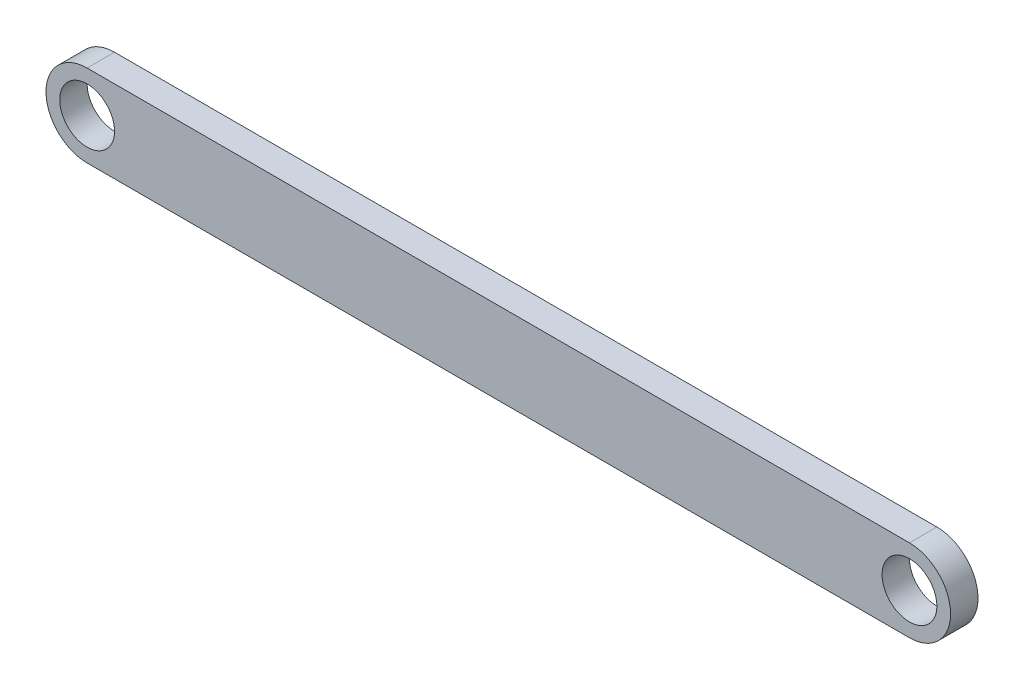
ISO-10303-21;
HEADER;
FILE_DESCRIPTION(('STEP AP214'),'2;1');
FILE_NAME('part.step','',(''),(''),'','','');
FILE_SCHEMA(('AUTOMOTIVE_DESIGN { 1 0 10303 214 1 1 1 1 }'));
ENDSEC;
DATA;
#1=APPLICATION_CONTEXT('core data for automotive mechanical design processes');
#2=APPLICATION_PROTOCOL_DEFINITION('international standard','automotive_design',2000,#1);
#3=PRODUCT_CONTEXT('',#1,'mechanical');
#4=PRODUCT('Part','Part','',(#3));
#5=PRODUCT_RELATED_PRODUCT_CATEGORY('part','',(#4));
#6=PRODUCT_DEFINITION_FORMATION('','',#4);
#7=PRODUCT_DEFINITION_CONTEXT('part definition',#1,'design');
#8=PRODUCT_DEFINITION('design','',#6,#7);
#9=PRODUCT_DEFINITION_SHAPE('','',#8);
#10=(LENGTH_UNIT() NAMED_UNIT(*) SI_UNIT(.MILLI.,.METRE.));
#11=(NAMED_UNIT(*) PLANE_ANGLE_UNIT() SI_UNIT($,.RADIAN.));
#12=(NAMED_UNIT(*) SI_UNIT($,.STERADIAN.) SOLID_ANGLE_UNIT());
#13=UNCERTAINTY_MEASURE_WITH_UNIT(LENGTH_MEASURE(1.E-05),#10,'distance_accuracy_value','');
#14=(GEOMETRIC_REPRESENTATION_CONTEXT(3) GLOBAL_UNCERTAINTY_ASSIGNED_CONTEXT((#13)) GLOBAL_UNIT_ASSIGNED_CONTEXT((#10,
#11,#12)) REPRESENTATION_CONTEXT('',''));
#15=CARTESIAN_POINT('',(0.,0.,0.));
#16=DIRECTION('',(0.,0.,1.));
#17=DIRECTION('',(1.,0.,0.));
#18=AXIS2_PLACEMENT_3D('',#15,#16,#17);
#19=CARTESIAN_POINT('',(-43.2944174376666,9.86428571428574,5.));
#20=DIRECTION('',(0.,0.,1.));
#21=DIRECTION('',(1.,0.,0.));
#22=AXIS2_PLACEMENT_3D('',#19,#20,#21);
#23=PLANE('',#22);
#24=CARTESIAN_POINT('',(-43.2944174376666,9.86428571428574,5.));
#25=DIRECTION('',(0.,0.,1.));
#26=DIRECTION('',(1.,0.,0.));
#27=AXIS2_PLACEMENT_3D('',#24,#25,#26);
#28=CIRCLE('',#27,5.);
#29=CARTESIAN_POINT('',(-38.2944174376666,9.86428571428574,5.));
#30=VERTEX_POINT('',#29);
#31=EDGE_CURVE('E100',#30,#30,#28,.T.);
#32=ORIENTED_EDGE('',*,*,#31,.F.);
#33=EDGE_LOOP('',(#32));
#34=FACE_BOUND('',#33,.T.);
#35=CARTESIAN_POINT('',(-43.2944174376666,9.86428571428574,5.));
#36=DIRECTION('',(0.,0.,1.));
#37=DIRECTION('',(1.,0.,0.));
#38=AXIS2_PLACEMENT_3D('',#35,#36,#37);
#39=CIRCLE('',#38,7.5);
#40=CARTESIAN_POINT('',(-43.2944174376666,17.3642857142857,5.));
#41=VERTEX_POINT('',#40);
#42=CARTESIAN_POINT('',(-43.2944174376666,2.36428571428574,5.));
#43=VERTEX_POINT('',#42);
#44=EDGE_CURVE('E85',#41,#43,#39,.T.);
#45=ORIENTED_EDGE('',*,*,#44,.T.);
#46=DIRECTION('',(1.,0.,0.));
#47=VECTOR('',#46,1.);
#48=CARTESIAN_POINT('',(-43.2944174376666,2.36428571428574,5.));
#49=LINE('',#48,#47);
#50=CARTESIAN_POINT('',(106.705582562333,2.36428571428574,5.));
#51=VERTEX_POINT('',#50);
#52=EDGE_CURVE('E80',#43,#51,#49,.T.);
#53=ORIENTED_EDGE('',*,*,#52,.T.);
#54=CARTESIAN_POINT('',(106.705582562333,9.86428571428574,5.));
#55=DIRECTION('',(0.,0.,1.));
#56=DIRECTION('',(1.,0.,0.));
#57=AXIS2_PLACEMENT_3D('',#54,#55,#56);
#58=CIRCLE('',#57,7.5);
#59=CARTESIAN_POINT('',(106.705582562333,17.3642857142857,5.));
#60=VERTEX_POINT('',#59);
#61=EDGE_CURVE('E83',#51,#60,#58,.T.);
#62=ORIENTED_EDGE('',*,*,#61,.T.);
#63=DIRECTION('',(-1.,0.,0.));
#64=VECTOR('',#63,1.);
#65=CARTESIAN_POINT('',(-43.2944174376666,17.3642857142857,5.));
#66=LINE('',#65,#64);
#67=EDGE_CURVE('E50',#60,#41,#66,.T.);
#68=ORIENTED_EDGE('',*,*,#67,.T.);
#69=EDGE_LOOP('',(#45,#53,#62,#68));
#70=FACE_BOUND('',#69,.T.);
#71=CARTESIAN_POINT('',(106.705582562333,9.86428571428574,5.));
#72=DIRECTION('',(0.,0.,1.));
#73=DIRECTION('',(1.,0.,0.));
#74=AXIS2_PLACEMENT_3D('',#71,#72,#73);
#75=CIRCLE('',#74,5.);
#76=CARTESIAN_POINT('',(111.705582562333,9.86428571428574,5.));
#77=VERTEX_POINT('',#76);
#78=EDGE_CURVE('E115',#77,#77,#75,.T.);
#79=ORIENTED_EDGE('',*,*,#78,.F.);
#80=EDGE_LOOP('',(#79));
#81=FACE_BOUND('',#80,.T.);
#82=ADVANCED_FACE('F33',(#34,#70,#81),#23,.T.);
#83=CARTESIAN_POINT('',(-43.2944174376666,9.86428571428574,0.));
#84=DIRECTION('',(0.,0.,1.));
#85=DIRECTION('',(1.,0.,0.));
#86=AXIS2_PLACEMENT_3D('',#83,#84,#85);
#87=PLANE('',#86);
#88=CARTESIAN_POINT('',(-43.2944174376666,9.86428571428574,0.));
#89=DIRECTION('',(0.,0.,1.));
#90=DIRECTION('',(1.,0.,0.));
#91=AXIS2_PLACEMENT_3D('',#88,#89,#90);
#92=CIRCLE('',#91,7.5);
#93=CARTESIAN_POINT('',(-43.2944174376666,17.3642857142857,0.));
#94=VERTEX_POINT('',#93);
#95=CARTESIAN_POINT('',(-43.2944174376666,2.36428571428574,0.));
#96=VERTEX_POINT('',#95);
#97=EDGE_CURVE('E97',#94,#96,#92,.T.);
#98=ORIENTED_EDGE('',*,*,#97,.F.);
#99=DIRECTION('',(-1.,0.,0.));
#100=VECTOR('',#99,1.);
#101=CARTESIAN_POINT('',(-43.2944174376666,17.3642857142857,0.));
#102=LINE('',#101,#100);
#103=CARTESIAN_POINT('',(106.705582562333,17.3642857142857,0.));
#104=VERTEX_POINT('',#103);
#105=EDGE_CURVE('E73',#104,#94,#102,.T.);
#106=ORIENTED_EDGE('',*,*,#105,.F.);
#107=CARTESIAN_POINT('',(106.705582562333,9.86428571428574,0.));
#108=DIRECTION('',(0.,0.,1.));
#109=DIRECTION('',(1.,0.,0.));
#110=AXIS2_PLACEMENT_3D('',#107,#108,#109);
#111=CIRCLE('',#110,7.5);
#112=CARTESIAN_POINT('',(106.705582562333,2.36428571428574,0.));
#113=VERTEX_POINT('',#112);
#114=EDGE_CURVE('E67',#113,#104,#111,.T.);
#115=ORIENTED_EDGE('',*,*,#114,.F.);
#116=DIRECTION('',(1.,0.,0.));
#117=VECTOR('',#116,1.);
#118=CARTESIAN_POINT('',(-43.2944174376666,2.36428571428574,0.));
#119=LINE('',#118,#117);
#120=EDGE_CURVE('E89',#96,#113,#119,.T.);
#121=ORIENTED_EDGE('',*,*,#120,.F.);
#122=EDGE_LOOP('',(#98,#106,#115,#121));
#123=FACE_BOUND('',#122,.T.);
#124=CARTESIAN_POINT('',(-43.2944174376666,9.86428571428574,0.));
#125=DIRECTION('',(0.,0.,1.));
#126=DIRECTION('',(1.,0.,0.));
#127=AXIS2_PLACEMENT_3D('',#124,#125,#126);
#128=CIRCLE('',#127,5.);
#129=CARTESIAN_POINT('',(-38.2944174376666,9.86428571428574,0.));
#130=VERTEX_POINT('',#129);
#131=EDGE_CURVE('E112',#130,#130,#128,.T.);
#132=ORIENTED_EDGE('',*,*,#131,.T.);
#133=EDGE_LOOP('',(#132));
#134=FACE_BOUND('',#133,.T.);
#135=CARTESIAN_POINT('',(106.705582562333,9.86428571428574,0.));
#136=DIRECTION('',(0.,0.,1.));
#137=DIRECTION('',(1.,0.,0.));
#138=AXIS2_PLACEMENT_3D('',#135,#136,#137);
#139=CIRCLE('',#138,5.);
#140=CARTESIAN_POINT('',(111.705582562333,9.86428571428574,0.));
#141=VERTEX_POINT('',#140);
#142=EDGE_CURVE('E118',#141,#141,#139,.T.);
#143=ORIENTED_EDGE('',*,*,#142,.T.);
#144=EDGE_LOOP('',(#143));
#145=FACE_BOUND('',#144,.T.);
#146=ADVANCED_FACE('F108',(#123,#134,#145),#87,.F.);
#147=CARTESIAN_POINT('',(-43.2944174376666,9.86428571428574,5.));
#148=DIRECTION('',(0.,0.,-1.));
#149=DIRECTION('',(-1.,0.,0.));
#150=AXIS2_PLACEMENT_3D('',#147,#148,#149);
#151=CYLINDRICAL_SURFACE('',#150,7.5);
#152=ORIENTED_EDGE('',*,*,#97,.T.);
#153=DIRECTION('',(0.,0.,-1.));
#154=VECTOR('',#153,1.);
#155=CARTESIAN_POINT('',(-43.2944174376666,2.36428571428574,5.));
#156=LINE('',#155,#154);
#157=EDGE_CURVE('E11',#43,#96,#156,.T.);
#158=ORIENTED_EDGE('',*,*,#157,.F.);
#159=ORIENTED_EDGE('',*,*,#44,.F.);
#160=DIRECTION('',(0.,0.,-1.));
#161=VECTOR('',#160,1.);
#162=CARTESIAN_POINT('',(-43.2944174376666,17.3642857142857,5.));
#163=LINE('',#162,#161);
#164=EDGE_CURVE('E93',#41,#94,#163,.T.);
#165=ORIENTED_EDGE('',*,*,#164,.T.);
#166=EDGE_LOOP('',(#152,#158,#159,#165));
#167=FACE_BOUND('',#166,.T.);
#168=ADVANCED_FACE('F35',(#167),#151,.T.);
#169=CARTESIAN_POINT('',(-43.2944174376666,2.36428571428574,5.));
#170=DIRECTION('',(0.,1.,0.));
#171=DIRECTION('',(0.,0.,1.));
#172=AXIS2_PLACEMENT_3D('',#169,#170,#171);
#173=PLANE('',#172);
#174=ORIENTED_EDGE('',*,*,#120,.T.);
#175=DIRECTION('',(0.,0.,-1.));
#176=VECTOR('',#175,1.);
#177=CARTESIAN_POINT('',(106.705582562333,2.36428571428574,5.));
#178=LINE('',#177,#176);
#179=EDGE_CURVE('E42',#51,#113,#178,.T.);
#180=ORIENTED_EDGE('',*,*,#179,.F.);
#181=ORIENTED_EDGE('',*,*,#52,.F.);
#182=ORIENTED_EDGE('',*,*,#157,.T.);
#183=EDGE_LOOP('',(#174,#180,#181,#182));
#184=FACE_BOUND('',#183,.T.);
#185=ADVANCED_FACE('F88',(#184),#173,.F.);
#186=CARTESIAN_POINT('',(106.705582562333,9.86428571428574,5.));
#187=DIRECTION('',(0.,0.,-1.));
#188=DIRECTION('',(-1.,0.,0.));
#189=AXIS2_PLACEMENT_3D('',#186,#187,#188);
#190=CYLINDRICAL_SURFACE('',#189,7.5);
#191=ORIENTED_EDGE('',*,*,#114,.T.);
#192=DIRECTION('',(0.,0.,-1.));
#193=VECTOR('',#192,1.);
#194=CARTESIAN_POINT('',(106.705582562333,17.3642857142857,5.));
#195=LINE('',#194,#193);
#196=EDGE_CURVE('E90',#60,#104,#195,.T.);
#197=ORIENTED_EDGE('',*,*,#196,.F.);
#198=ORIENTED_EDGE('',*,*,#61,.F.);
#199=ORIENTED_EDGE('',*,*,#179,.T.);
#200=EDGE_LOOP('',(#191,#197,#198,#199));
#201=FACE_BOUND('',#200,.T.);
#202=ADVANCED_FACE('F91',(#201),#190,.T.);
#203=CARTESIAN_POINT('',(-43.2944174376666,17.3642857142857,5.));
#204=DIRECTION('',(0.,-1.,0.));
#205=DIRECTION('',(0.,0.,-1.));
#206=AXIS2_PLACEMENT_3D('',#203,#204,#205);
#207=PLANE('',#206);
#208=ORIENTED_EDGE('',*,*,#105,.T.);
#209=ORIENTED_EDGE('',*,*,#164,.F.);
#210=ORIENTED_EDGE('',*,*,#67,.F.);
#211=ORIENTED_EDGE('',*,*,#196,.T.);
#212=EDGE_LOOP('',(#208,#209,#210,#211));
#213=FACE_BOUND('',#212,.T.);
#214=ADVANCED_FACE('F105',(#213),#207,.F.);
#215=CARTESIAN_POINT('',(-43.2944174376666,9.86428571428574,5.));
#216=DIRECTION('',(0.,0.,-1.));
#217=DIRECTION('',(-1.,0.,0.));
#218=AXIS2_PLACEMENT_3D('',#215,#216,#217);
#219=CYLINDRICAL_SURFACE('',#218,5.);
#220=ORIENTED_EDGE('',*,*,#31,.T.);
#221=EDGE_LOOP('',(#220));
#222=FACE_BOUND('',#221,.T.);
#223=ORIENTED_EDGE('',*,*,#131,.F.);
#224=EDGE_LOOP('',(#223));
#225=FACE_BOUND('',#224,.T.);
#226=ADVANCED_FACE('F135',(#222,#225),#219,.F.);
#227=CARTESIAN_POINT('',(106.705582562333,9.86428571428574,5.));
#228=DIRECTION('',(0.,0.,-1.));
#229=DIRECTION('',(-1.,0.,0.));
#230=AXIS2_PLACEMENT_3D('',#227,#228,#229);
#231=CYLINDRICAL_SURFACE('',#230,5.);
#232=ORIENTED_EDGE('',*,*,#78,.T.);
#233=EDGE_LOOP('',(#232));
#234=FACE_BOUND('',#233,.T.);
#235=ORIENTED_EDGE('',*,*,#142,.F.);
#236=EDGE_LOOP('',(#235));
#237=FACE_BOUND('',#236,.T.);
#238=ADVANCED_FACE('F124',(#234,#237),#231,.F.);
#239=CLOSED_SHELL('',(#82,#146,#168,#185,#202,#214,#226,#238));
#240=MANIFOLD_SOLID_BREP('B2',#239);
#241=ADVANCED_BREP_SHAPE_REPRESENTATION('',(#18,#240),#14);
#242=SHAPE_DEFINITION_REPRESENTATION(#9,#241);
ENDSEC;
END-ISO-10303-21;
